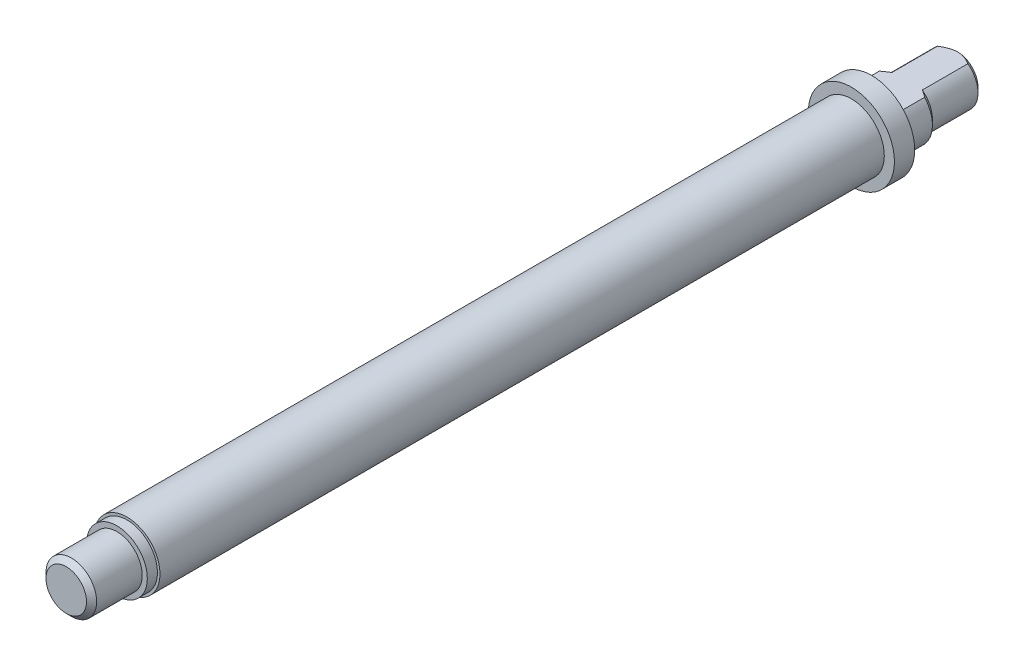
ISO-10303-21;
HEADER;
FILE_DESCRIPTION(('STEP AP214'),'2;1');
FILE_NAME('part.step','',(''),(''),'','','');
FILE_SCHEMA(('AUTOMOTIVE_DESIGN { 1 0 10303 214 1 1 1 1 }'));
ENDSEC;
DATA;
#1=APPLICATION_CONTEXT('core data for automotive mechanical design processes');
#2=APPLICATION_PROTOCOL_DEFINITION('international standard','automotive_design',2000,#1);
#3=PRODUCT_CONTEXT('',#1,'mechanical');
#4=PRODUCT('Part','Part','',(#3));
#5=PRODUCT_RELATED_PRODUCT_CATEGORY('part','',(#4));
#6=PRODUCT_DEFINITION_FORMATION('','',#4);
#7=PRODUCT_DEFINITION_CONTEXT('part definition',#1,'design');
#8=PRODUCT_DEFINITION('design','',#6,#7);
#9=PRODUCT_DEFINITION_SHAPE('','',#8);
#10=(LENGTH_UNIT() NAMED_UNIT(*) SI_UNIT(.MILLI.,.METRE.));
#11=(NAMED_UNIT(*) PLANE_ANGLE_UNIT() SI_UNIT($,.RADIAN.));
#12=(NAMED_UNIT(*) SI_UNIT($,.STERADIAN.) SOLID_ANGLE_UNIT());
#13=UNCERTAINTY_MEASURE_WITH_UNIT(LENGTH_MEASURE(1.E-05),#10,'distance_accuracy_value','');
#14=(GEOMETRIC_REPRESENTATION_CONTEXT(3) GLOBAL_UNCERTAINTY_ASSIGNED_CONTEXT((#13)) GLOBAL_UNIT_ASSIGNED_CONTEXT((#10,
#11,#12)) REPRESENTATION_CONTEXT('',''));
#15=CARTESIAN_POINT('',(0.,0.,0.));
#16=DIRECTION('',(0.,0.,1.));
#17=DIRECTION('',(1.,0.,0.));
#18=AXIS2_PLACEMENT_3D('',#15,#16,#17);
#19=CARTESIAN_POINT('',(0.,0.,36.75));
#20=DIRECTION('',(0.,0.,1.));
#21=DIRECTION('',(1.,0.,0.));
#22=AXIS2_PLACEMENT_3D('',#19,#20,#21);
#23=PLANE('',#22);
#24=CARTESIAN_POINT('',(0.,0.,36.75));
#25=DIRECTION('',(0.,0.,1.));
#26=DIRECTION('',(1.,0.,0.));
#27=AXIS2_PLACEMENT_3D('',#24,#25,#26);
#28=CIRCLE('',#27,3.);
#29=CARTESIAN_POINT('',(3.,0.,36.75));
#30=VERTEX_POINT('',#29);
#31=EDGE_CURVE('E141',#30,#30,#28,.T.);
#32=ORIENTED_EDGE('',*,*,#31,.F.);
#33=EDGE_LOOP('',(#32));
#34=FACE_BOUND('',#33,.T.);
#35=CARTESIAN_POINT('',(0.,0.,36.75));
#36=DIRECTION('',(0.,0.,1.));
#37=DIRECTION('',(1.,0.,0.));
#38=AXIS2_PLACEMENT_3D('',#35,#36,#37);
#39=CIRCLE('',#38,3.25);
#40=CARTESIAN_POINT('',(3.25,0.,36.75));
#41=VERTEX_POINT('',#40);
#42=EDGE_CURVE('E154',#41,#41,#39,.T.);
#43=ORIENTED_EDGE('',*,*,#42,.T.);
#44=EDGE_LOOP('',(#43));
#45=FACE_BOUND('',#44,.T.);
#46=ADVANCED_FACE('F34',(#34,#45),#23,.T.);
#47=CARTESIAN_POINT('',(0.,0.,37.75));
#48=DIRECTION('',(0.,0.,1.));
#49=DIRECTION('',(1.,0.,0.));
#50=AXIS2_PLACEMENT_3D('',#47,#48,#49);
#51=PLANE('',#50);
#52=CARTESIAN_POINT('',(0.,0.,37.75));
#53=DIRECTION('',(0.,0.,1.));
#54=DIRECTION('',(1.,0.,0.));
#55=AXIS2_PLACEMENT_3D('',#52,#53,#54);
#56=CIRCLE('',#55,3.);
#57=CARTESIAN_POINT('',(3.,0.,37.75));
#58=VERTEX_POINT('',#57);
#59=EDGE_CURVE('E107',#58,#58,#56,.T.);
#60=ORIENTED_EDGE('',*,*,#59,.T.);
#61=EDGE_LOOP('',(#60));
#62=FACE_BOUND('',#61,.T.);
#63=CARTESIAN_POINT('',(0.,0.,37.75));
#64=DIRECTION('',(0.,0.,1.));
#65=DIRECTION('',(1.,0.,0.));
#66=AXIS2_PLACEMENT_3D('',#63,#64,#65);
#67=CIRCLE('',#66,2.5);
#68=CARTESIAN_POINT('',(2.5,0.,37.75));
#69=VERTEX_POINT('',#68);
#70=EDGE_CURVE('E138',#69,#69,#67,.T.);
#71=ORIENTED_EDGE('',*,*,#70,.F.);
#72=EDGE_LOOP('',(#71));
#73=FACE_BOUND('',#72,.T.);
#74=ADVANCED_FACE('F150',(#62,#73),#51,.T.);
#75=CARTESIAN_POINT('',(0.,0.,37.75));
#76=DIRECTION('',(0.,0.,-1.));
#77=DIRECTION('',(-1.,0.,0.));
#78=AXIS2_PLACEMENT_3D('',#75,#76,#77);
#79=CYLINDRICAL_SURFACE('',#78,3.);
#80=ORIENTED_EDGE('',*,*,#59,.F.);
#81=EDGE_LOOP('',(#80));
#82=FACE_BOUND('',#81,.T.);
#83=ORIENTED_EDGE('',*,*,#31,.T.);
#84=EDGE_LOOP('',(#83));
#85=FACE_BOUND('',#84,.T.);
#86=ADVANCED_FACE('F146',(#82,#85),#79,.T.);
#87=CARTESIAN_POINT('',(0.,0.,42.75));
#88=DIRECTION('',(0.,0.,-1.));
#89=DIRECTION('',(-1.,0.,0.));
#90=AXIS2_PLACEMENT_3D('',#87,#88,#89);
#91=CYLINDRICAL_SURFACE('',#90,2.5);
#92=CARTESIAN_POINT('',(0.,0.,42.25));
#93=DIRECTION('',(0.,0.,1.));
#94=DIRECTION('',(1.,0.,0.));
#95=AXIS2_PLACEMENT_3D('',#92,#93,#94);
#96=CIRCLE('',#95,2.5);
#97=CARTESIAN_POINT('',(2.5,0.,42.25));
#98=VERTEX_POINT('',#97);
#99=EDGE_CURVE('E116',#98,#98,#96,.F.);
#100=ORIENTED_EDGE('',*,*,#99,.T.);
#101=EDGE_LOOP('',(#100));
#102=FACE_BOUND('',#101,.T.);
#103=ORIENTED_EDGE('',*,*,#70,.T.);
#104=EDGE_LOOP('',(#103));
#105=FACE_BOUND('',#104,.T.);
#106=ADVANCED_FACE('F190',(#102,#105),#91,.T.);
#107=CARTESIAN_POINT('',(0.,0.,42.75));
#108=DIRECTION('',(0.,0.,1.));
#109=DIRECTION('',(1.,0.,0.));
#110=AXIS2_PLACEMENT_3D('',#107,#108,#109);
#111=PLANE('',#110);
#112=CARTESIAN_POINT('',(0.,0.,42.75));
#113=DIRECTION('',(0.,0.,1.));
#114=DIRECTION('',(1.,0.,0.));
#115=AXIS2_PLACEMENT_3D('',#112,#113,#114);
#116=CIRCLE('',#115,2.00000000000003);
#117=CARTESIAN_POINT('',(2.00000000000003,0.,42.75));
#118=VERTEX_POINT('',#117);
#119=EDGE_CURVE('E113',#118,#118,#116,.T.);
#120=ORIENTED_EDGE('',*,*,#119,.T.);
#121=EDGE_LOOP('',(#120));
#122=FACE_BOUND('',#121,.T.);
#123=ADVANCED_FACE('F186',(#122),#111,.T.);
#124=CARTESIAN_POINT('',(0.,0.,42.75));
#125=DIRECTION('',(0.,0.,-1.));
#126=DIRECTION('',(-1.,0.,0.));
#127=AXIS2_PLACEMENT_3D('',#124,#125,#126);
#128=CONICAL_SURFACE('',#127,2.00000000000003,0.785398163397439);
#129=ORIENTED_EDGE('',*,*,#99,.F.);
#130=EDGE_LOOP('',(#129));
#131=FACE_BOUND('',#130,.T.);
#132=ORIENTED_EDGE('',*,*,#119,.F.);
#133=EDGE_LOOP('',(#132));
#134=FACE_BOUND('',#133,.T.);
#135=ADVANCED_FACE('F189',(#131,#134),#128,.T.);
#136=CARTESIAN_POINT('',(0.,0.,-34.75));
#137=DIRECTION('',(0.,0.,1.));
#138=DIRECTION('',(1.,0.,0.));
#139=AXIS2_PLACEMENT_3D('',#136,#137,#138);
#140=PLANE('',#139);
#141=CARTESIAN_POINT('',(0.,0.,-34.75));
#142=DIRECTION('',(0.,0.,1.));
#143=DIRECTION('',(1.,0.,0.));
#144=AXIS2_PLACEMENT_3D('',#141,#142,#143);
#145=CIRCLE('',#144,3.25);
#146=CARTESIAN_POINT('',(3.25,0.,-34.75));
#147=VERTEX_POINT('',#146);
#148=EDGE_CURVE('E156',#147,#147,#145,.T.);
#149=ORIENTED_EDGE('',*,*,#148,.F.);
#150=EDGE_LOOP('',(#149));
#151=FACE_BOUND('',#150,.T.);
#152=CARTESIAN_POINT('',(0.,0.,-34.75));
#153=DIRECTION('',(0.,0.,1.));
#154=DIRECTION('',(1.,0.,0.));
#155=AXIS2_PLACEMENT_3D('',#152,#153,#154);
#156=CIRCLE('',#155,4.25);
#157=CARTESIAN_POINT('',(4.25,0.,-34.75));
#158=VERTEX_POINT('',#157);
#159=EDGE_CURVE('E87',#158,#158,#156,.T.);
#160=ORIENTED_EDGE('',*,*,#159,.T.);
#161=EDGE_LOOP('',(#160));
#162=FACE_BOUND('',#161,.T.);
#163=ADVANCED_FACE('F176',(#151,#162),#140,.T.);
#164=CARTESIAN_POINT('',(0.,0.,-34.75));
#165=DIRECTION('',(0.,0.,1.));
#166=DIRECTION('',(1.,0.,0.));
#167=AXIS2_PLACEMENT_3D('',#164,#165,#166);
#168=CYLINDRICAL_SURFACE('',#167,3.25);
#169=ORIENTED_EDGE('',*,*,#148,.T.);
#170=EDGE_LOOP('',(#169));
#171=FACE_BOUND('',#170,.T.);
#172=ORIENTED_EDGE('',*,*,#42,.F.);
#173=EDGE_LOOP('',(#172));
#174=FACE_BOUND('',#173,.T.);
#175=ADVANCED_FACE('F170',(#171,#174),#168,.T.);
#176=CARTESIAN_POINT('',(0.,0.,-45.25));
#177=DIRECTION('',(0.,0.,-1.));
#178=DIRECTION('',(-1.,0.,0.));
#179=AXIS2_PLACEMENT_3D('',#176,#177,#178);
#180=PLANE('',#179);
#181=CARTESIAN_POINT('',(0.,0.,-45.25));
#182=DIRECTION('',(0.,0.,-1.));
#183=DIRECTION('',(-1.,0.,0.));
#184=AXIS2_PLACEMENT_3D('',#181,#182,#183);
#185=CIRCLE('',#184,2.00000000000003);
#186=CARTESIAN_POINT('',(0.,2.,-45.25));
#187=VERTEX_POINT('',#186);
#188=EDGE_CURVE('E100',#187,#187,#185,.T.);
#189=ORIENTED_EDGE('',*,*,#188,.T.);
#190=EDGE_LOOP('',(#189));
#191=FACE_BOUND('',#190,.T.);
#192=ADVANCED_FACE('F168',(#191),#180,.T.);
#193=CARTESIAN_POINT('',(0.,0.,-45.25));
#194=DIRECTION('',(0.,0.,1.));
#195=DIRECTION('',(1.,0.,0.));
#196=AXIS2_PLACEMENT_3D('',#193,#194,#195);
#197=CONICAL_SURFACE('',#196,2.00000000000003,0.785398163397439);
#198=CARTESIAN_POINT('',(-4.02524487287732,2.,-42.7552701653353));
#199=CARTESIAN_POINT('',(-3.93338656559503,2.,-42.8375217206694));
#200=CARTESIAN_POINT('',(-3.84126127996534,2.,-42.9194777630483));
#201=CARTESIAN_POINT('',(-3.65633622016193,2.,-43.0826420150682));
#202=CARTESIAN_POINT('',(-3.56353638507523,2.,-43.1638501556327));
#203=CARTESIAN_POINT('',(-3.37679065484129,2.,-43.3256480230057));
#204=CARTESIAN_POINT('',(-3.28284177522376,2.,-43.4062343111818));
#205=CARTESIAN_POINT('',(-3.09396170046439,2.,-43.566241356936));
#206=CARTESIAN_POINT('',(-2.99903054598731,2.,-43.6456621624367));
#207=CARTESIAN_POINT('',(-2.80231868574972,2.,-43.8076618695362));
#208=CARTESIAN_POINT('',(-2.7004639581137,2.,-43.8901511403073));
#209=CARTESIAN_POINT('',(-2.49502065799541,2.,-44.0529394966641));
#210=CARTESIAN_POINT('',(-2.39143218029121,2.,-44.1332387013461));
#211=CARTESIAN_POINT('',(-2.18217141569413,2.,-44.2907552208728));
#212=CARTESIAN_POINT('',(-2.07650249233657,2.,-44.3679769835109));
#213=CARTESIAN_POINT('',(-1.86228016066993,2.,-44.5182890730739));
#214=CARTESIAN_POINT('',(-1.7537276355555,2.,-44.5913806440338));
#215=CARTESIAN_POINT('',(-1.56257875752936,2.,-44.7127220691165));
#216=CARTESIAN_POINT('',(-1.48086803544078,2.,-44.7623596167979));
#217=CARTESIAN_POINT('',(-1.31495821323155,2.,-44.8574104299912));
#218=CARTESIAN_POINT('',(-1.23075822227053,2.,-44.9028221584837));
#219=CARTESIAN_POINT('',(-1.06023902355461,2.,-44.9875500940183));
#220=CARTESIAN_POINT('',(-0.973945152787866,2.,-45.0269166708474));
#221=CARTESIAN_POINT('',(-0.798278775330244,2.,-45.0980658869435));
#222=CARTESIAN_POINT('',(-0.708908734252937,2.,-45.1298544452973));
#223=CARTESIAN_POINT('',(-0.559541387776288,2.,-45.1739554616647));
#224=CARTESIAN_POINT('',(-0.500403045428492,2.,-45.1891736445886));
#225=CARTESIAN_POINT('',(-0.381108626655489,2.,-45.2148450536554));
#226=CARTESIAN_POINT('',(-0.320952978782938,2.,-45.225300236847));
#227=CARTESIAN_POINT('',(-0.200181452597934,2.,-45.2408949804001));
#228=CARTESIAN_POINT('',(-0.139568224383854,2.,-45.2460547746351));
#229=CARTESIAN_POINT('',(-0.0181203079271185,2.,-45.2508382229008));
#230=CARTESIAN_POINT('',(0.0427143780219665,2.,-45.2504619341049));
#231=CARTESIAN_POINT('',(0.163839037596709,2.,-45.244208583769));
#232=CARTESIAN_POINT('',(0.224130225918196,2.,-45.2383546366808));
#233=CARTESIAN_POINT('',(0.343991547443547,2.,-45.2215015109567));
#234=CARTESIAN_POINT('',(0.403561514966845,2.,-45.2105011722532));
#235=CARTESIAN_POINT('',(0.522342234602058,2.,-45.1837349239598));
#236=CARTESIAN_POINT('',(0.581540567552781,2.,-45.1679146042935));
#237=CARTESIAN_POINT('',(0.698671365380795,2.,-45.1322112796639));
#238=CARTESIAN_POINT('',(0.756604050119123,2.,-45.1123289866356));
#239=CARTESIAN_POINT('',(0.887860927745178,2.,-45.0628560581075));
#240=CARTESIAN_POINT('',(0.960752844289883,2.,-45.0321244984101));
#241=CARTESIAN_POINT('',(1.10449637010197,2.,-44.9661808969027));
#242=CARTESIAN_POINT('',(1.17534687727413,2.,-44.9309664885298));
#243=CARTESIAN_POINT('',(1.31542984339301,2.,-44.8569247865524));
#244=CARTESIAN_POINT('',(1.38465593395351,2.,-44.8180855391967));
#245=CARTESIAN_POINT('',(1.52149299869846,2.,-44.7376549997552));
#246=CARTESIAN_POINT('',(1.58910373202624,2.,-44.6960633007095));
#247=CARTESIAN_POINT('',(1.71962468526386,2.,-44.6128214933671));
#248=CARTESIAN_POINT('',(1.78260199281822,2.,-44.5712760281912));
#249=CARTESIAN_POINT('',(1.90748425118683,2.,-44.4865978718586));
#250=CARTESIAN_POINT('',(1.96938911660686,2.,-44.4434650551541));
#251=CARTESIAN_POINT('',(2.09174110166171,2.,-44.3562912155002));
#252=CARTESIAN_POINT('',(2.15219622437851,2.,-44.3122613860916));
#253=CARTESIAN_POINT('',(2.27230748022882,2.,-44.223157067966));
#254=CARTESIAN_POINT('',(2.33196382265272,2.,-44.1780828616879));
#255=CARTESIAN_POINT('',(2.39129047517791,2.,-44.1325859856804));
#256=B_SPLINE_CURVE_WITH_KNOTS('',3,(#198,#199,#200,#201,#202,#203,#204,#205,#206,#207,#208,
#209,#210,#211,#212,#213,#214,#215,#216,#217,#218,#219,#220,#221,#222,#223,#224,#225,#226,#227,
#228,#229,#230,#231,#232,#233,#234,#235,#236,#237,#238,#239,#240,#241,#242,#243,#244,#245,#246,
#247,#248,#249,#250,#251,#252,#253,#254,#255),.UNSPECIFIED.,.F.,.F.,(4,2,2,2,2,2,2,2,2,2,2,2,2,
2,2,2,2,2,2,2,2,2,2,2,2,2,2,2,4),(0.,0.369906577290642,0.739846983359827,1.11116790415774,
1.48247351382389,1.87565592605001,2.26881691411835,2.66138738129623,3.05383896694485,
3.34056558561761,3.6273960884676,3.91168916131591,4.19575944375506,4.37878987167405,
4.56174502701619,4.74399847152468,4.92625003382966,5.1077359882982,5.28926287192774,
5.4729200122429,5.65654499086521,5.89365897291801,6.13089865416207,6.36895036811938,
6.60703735784724,6.83334806436309,7.05967670901748,7.28403255416335,7.50832841730318),.UNSPECIFIED.);
#257=CARTESIAN_POINT('',(1.5,2.,-44.75));
#258=VERTEX_POINT('',#257);
#259=EDGE_CURVE('E128',#258,#187,#256,.F.);
#260=ORIENTED_EDGE('',*,*,#259,.F.);
#261=CARTESIAN_POINT('',(0.,0.,-44.75));
#262=DIRECTION('',(0.,0.,-1.));
#263=DIRECTION('',(-1.,0.,0.));
#264=AXIS2_PLACEMENT_3D('',#261,#262,#263);
#265=CIRCLE('',#264,2.5);
#266=CARTESIAN_POINT('',(-1.5,2.,-44.75));
#267=VERTEX_POINT('',#266);
#268=EDGE_CURVE('E104',#267,#258,#265,.F.);
#269=ORIENTED_EDGE('',*,*,#268,.F.);
#270=EDGE_CURVE('E121',#187,#267,#256,.F.);
#271=ORIENTED_EDGE('',*,*,#270,.F.);
#272=ORIENTED_EDGE('',*,*,#188,.F.);
#273=EDGE_LOOP('',(#260,#269,#271,#272));
#274=FACE_BOUND('',#273,.T.);
#275=ADVANCED_FACE('F165',(#274),#197,.T.);
#276=CARTESIAN_POINT('',(0.,0.,-45.25));
#277=DIRECTION('',(0.,0.,1.));
#278=DIRECTION('',(1.,0.,0.));
#279=AXIS2_PLACEMENT_3D('',#276,#277,#278);
#280=CYLINDRICAL_SURFACE('',#279,2.5);
#281=ORIENTED_EDGE('',*,*,#268,.T.);
#282=DIRECTION('',(0.,0.,1.));
#283=VECTOR('',#282,1.);
#284=CARTESIAN_POINT('',(1.5,2.,-45.25));
#285=LINE('',#284,#283);
#286=CARTESIAN_POINT('',(1.5,2.,-40.25));
#287=VERTEX_POINT('',#286);
#288=EDGE_CURVE('E96',#258,#287,#285,.T.);
#289=ORIENTED_EDGE('',*,*,#288,.T.);
#290=CARTESIAN_POINT('',(0.,0.,-40.25));
#291=DIRECTION('',(0.,0.,-1.));
#292=DIRECTION('',(-1.,0.,0.));
#293=AXIS2_PLACEMENT_3D('',#290,#291,#292);
#294=CIRCLE('',#293,2.5);
#295=CARTESIAN_POINT('',(-1.5,2.,-40.25));
#296=VERTEX_POINT('',#295);
#297=EDGE_CURVE('E95',#287,#296,#294,.T.);
#298=ORIENTED_EDGE('',*,*,#297,.T.);
#299=DIRECTION('',(0.,0.,1.));
#300=VECTOR('',#299,1.);
#301=CARTESIAN_POINT('',(-1.5,2.,-45.25));
#302=LINE('',#301,#300);
#303=EDGE_CURVE('E55',#296,#267,#302,.F.);
#304=ORIENTED_EDGE('',*,*,#303,.T.);
#305=EDGE_LOOP('',(#281,#289,#298,#304));
#306=FACE_BOUND('',#305,.T.);
#307=ADVANCED_FACE('F126',(#306),#280,.T.);
#308=CARTESIAN_POINT('',(0.,0.,-40.25));
#309=DIRECTION('',(0.,0.,1.));
#310=DIRECTION('',(1.,0.,0.));
#311=AXIS2_PLACEMENT_3D('',#308,#309,#310);
#312=CONICAL_SURFACE('',#311,2.50000000000002,0.785398163397453);
#313=CARTESIAN_POINT('',(6.30297669939974,2.,-36.1373216263623));
#314=CARTESIAN_POINT('',(6.19161538231923,2.,-36.2434654188677));
#315=CARTESIAN_POINT('',(6.08012784166976,2.,-36.3494766865766));
#316=CARTESIAN_POINT('',(5.85685182740821,2.,-36.5611832346176));
#317=CARTESIAN_POINT('',(5.74506335186336,2.,-36.666878512911));
#318=CARTESIAN_POINT('',(5.40910374007522,2.,-36.9834799534095));
#319=CARTESIAN_POINT('',(5.18441017570405,2.,-37.1938332007284));
#320=CARTESIAN_POINT('',(4.73080338017173,2.,-37.6145130906793));
#321=CARTESIAN_POINT('',(4.50187041839723,2.,-37.8248184834026));
#322=CARTESIAN_POINT('',(4.04109600653748,2.,-38.2421398339185));
#323=CARTESIAN_POINT('',(3.80925519025911,2.,-38.4491564869832));
#324=CARTESIAN_POINT('',(3.41557477398931,2.,-38.7927094339617));
#325=CARTESIAN_POINT('',(3.25498354268553,2.,-38.9306734892414));
#326=CARTESIAN_POINT('',(2.93065759329857,2.,-39.2030414106355));
#327=CARTESIAN_POINT('',(2.76692149007151,2.,-39.3374436429248));
#328=CARTESIAN_POINT('',(2.51812669562772,2.,-39.5346540132489));
#329=CARTESIAN_POINT('',(2.43475662118931,2.,-39.599589732802));
#330=CARTESIAN_POINT('',(2.26663374732058,2.,-39.7276417312762));
#331=CARTESIAN_POINT('',(2.18188103848771,2.,-39.7907581286648));
#332=CARTESIAN_POINT('',(2.01072574565119,2.,-39.9145933363178));
#333=CARTESIAN_POINT('',(1.92432436509388,2.,-39.9753138031099));
#334=CARTESIAN_POINT('',(1.74941695008951,2.,-40.0936296466813));
#335=CARTESIAN_POINT('',(1.66091137740154,2.,-40.1512257001644));
#336=CARTESIAN_POINT('',(1.50227028732209,2.,-40.2492212710428));
#337=CARTESIAN_POINT('',(1.43267637104491,2.,-40.2904935943275));
#338=CARTESIAN_POINT('',(1.29167710661282,2.,-40.3698677964186));
#339=CARTESIAN_POINT('',(1.22027148128114,2.,-40.4079691862347));
#340=CARTESIAN_POINT('',(1.07546452699163,2.,-40.4800460130542));
#341=CARTESIAN_POINT('',(1.00206522711492,2.,-40.5140254658395));
#342=CARTESIAN_POINT('',(0.853081142949222,2.,-40.5767151787812));
#343=CARTESIAN_POINT('',(0.777497091069965,2.,-40.6054271816017));
#344=CARTESIAN_POINT('',(0.584403393214701,2.,-40.6692396638115));
#345=CARTESIAN_POINT('',(0.465352306558866,2.,-40.7000128348776));
#346=CARTESIAN_POINT('',(0.28439755594838,2.,-40.7307588195802));
#347=CARTESIAN_POINT('',(0.223763847529603,2.,-40.738438502314));
#348=CARTESIAN_POINT('',(0.102037460980343,2.,-40.7483151195682));
#349=CARTESIAN_POINT('',(0.0409448065907219,2.,-40.7505123357594));
#350=CARTESIAN_POINT('',(-0.0813412240179013,2.,-40.7492836906337));
#351=CARTESIAN_POINT('',(-0.142534443442943,2.,-40.7458430479095));
#352=CARTESIAN_POINT('',(-0.264365149349608,2.,-40.7335143071468));
#353=CARTESIAN_POINT('',(-0.325002595336135,2.,-40.7246258153165));
#354=CARTESIAN_POINT('',(-0.445513581327994,2.,-40.7018382366568));
#355=CARTESIAN_POINT('',(-0.505384108194542,2.,-40.687923432345));
#356=CARTESIAN_POINT('',(-0.623920460080722,2.,-40.6557165246167));
#357=CARTESIAN_POINT('',(-0.682586214925769,2.,-40.6374241670009));
#358=CARTESIAN_POINT('',(-0.870096679141436,2.,-40.5723195036355));
#359=CARTESIAN_POINT('',(-0.996380524334678,2.,-40.5181300929727));
#360=CARTESIAN_POINT('',(-1.24305957355021,2.,-40.397647858965));
#361=CARTESIAN_POINT('',(-1.36344236007691,2.,-40.3313307945582));
#362=CARTESIAN_POINT('',(-1.60114682986076,2.,-40.1898352181218));
#363=CARTESIAN_POINT('',(-1.71840078274321,2.,-40.1145442578528));
#364=CARTESIAN_POINT('',(-1.89143789202107,2.,-39.9975913945842));
#365=CARTESIAN_POINT('',(-1.94861845845224,2.,-39.957955998579));
#366=CARTESIAN_POINT('',(-2.06217670530463,2.,-39.877551275221));
#367=CARTESIAN_POINT('',(-2.11855440502141,2.,-39.8367819751894));
#368=CARTESIAN_POINT('',(-2.27151937990438,2.,-39.7241967692871));
#369=CARTESIAN_POINT('',(-2.36741546158154,2.,-39.6514431443247));
#370=CARTESIAN_POINT('',(-2.55757734840221,2.,-39.503830369953));
#371=CARTESIAN_POINT('',(-2.65184301372985,2.,-39.4289710414012));
#372=CARTESIAN_POINT('',(-2.83909574994448,2.,-39.2776197624692));
#373=CARTESIAN_POINT('',(-2.93208245025607,2.,-39.2011273546396));
#374=CARTESIAN_POINT('',(-3.11700238327248,2.,-39.0468779319395));
#375=CARTESIAN_POINT('',(-3.2089355891292,2.,-38.9691208849616));
#376=CARTESIAN_POINT('',(-3.48375900151838,2.,-38.7340952575394));
#377=CARTESIAN_POINT('',(-3.6653640747173,2.,-38.5753249307298));
#378=CARTESIAN_POINT('',(-4.02619748135236,2.,-38.2551814767042));
#379=CARTESIAN_POINT('',(-4.20542620770818,2.,-38.0938087898096));
#380=CARTESIAN_POINT('',(-4.54602117157567,2.,-37.7839365817311));
#381=CARTESIAN_POINT('',(-4.70753312366636,2.,-37.6355969838317));
#382=CARTESIAN_POINT('',(-5.02950930464932,2.,-37.3377703518185));
#383=CARTESIAN_POINT('',(-5.18997348014397,2.,-37.188283260057));
#384=CARTESIAN_POINT('',(-5.50956314093424,2.,-36.8889288168519));
#385=CARTESIAN_POINT('',(-5.66869128700745,2.,-36.7390643030356));
#386=CARTESIAN_POINT('',(-5.98628664721593,2.,-36.4386586900714));
#387=CARTESIAN_POINT('',(-6.14475390713851,2.,-36.2881176393484));
#388=CARTESIAN_POINT('',(-6.30297669939974,2.,-36.1373216263623));
#389=B_SPLINE_CURVE_WITH_KNOTS('',3,(#313,#314,#315,#316,#317,#318,#319,#320,#321,#322,#323,
#324,#325,#326,#327,#328,#329,#330,#331,#332,#333,#334,#335,#336,#337,#338,#339,#340,#341,#342,
#343,#344,#345,#346,#347,#348,#349,#350,#351,#352,#353,#354,#355,#356,#357,#358,#359,#360,#361,
#362,#363,#364,#365,#366,#367,#368,#369,#370,#371,#372,#373,#374,#375,#376,#377,#378,#379,#380,
#381,#382,#383,#384,#385,#386,#387,#388),.UNSPECIFIED.,.F.,.F.,(4,2,2,2,2,2,2,2,2,2,2,2,2,2,2,2,
2,2,2,2,2,2,2,2,2,2,2,2,2,2,2,2,2,2,2,2,2,4),(0.,0.461530395848075,0.923063762999847,
1.84642814570782,2.77901494137714,3.71140188239747,4.34652018448138,4.98192494520126,
5.29893184459037,5.61591805480016,5.93268111936175,6.24937530133091,6.49204579715619,
6.73475364617262,6.97722310585566,7.21961220258087,7.58685502448715,7.76999772547678,
7.953131017015,8.13674521833649,8.32037269357642,8.50457942200895,8.68879684970659,
9.09991327785315,9.51186062066993,9.92965689883878,10.1383717107001,10.3470814979543,
10.7081519451167,11.0692532037655,11.4304569749129,11.7916699308901,12.5152929670805,
13.2387948242448,13.8966755650346,14.5545895756197,15.2103542781078,15.8660727671493),.UNSPECIFIED.);
#390=CARTESIAN_POINT('',(2.23606797749979,2.,-39.75));
#391=VERTEX_POINT('',#390);
#392=EDGE_CURVE('E11',#391,#287,#389,.T.);
#393=ORIENTED_EDGE('',*,*,#392,.F.);
#394=CARTESIAN_POINT('',(0.,0.,-39.75));
#395=DIRECTION('',(0.,0.,-1.));
#396=DIRECTION('',(-1.,0.,0.));
#397=AXIS2_PLACEMENT_3D('',#394,#395,#396);
#398=CIRCLE('',#397,3.);
#399=CARTESIAN_POINT('',(-2.23606797749979,2.,-39.75));
#400=VERTEX_POINT('',#399);
#401=EDGE_CURVE('E94',#400,#391,#398,.F.);
#402=ORIENTED_EDGE('',*,*,#401,.F.);
#403=EDGE_CURVE('E39',#296,#400,#389,.T.);
#404=ORIENTED_EDGE('',*,*,#403,.F.);
#405=ORIENTED_EDGE('',*,*,#297,.F.);
#406=EDGE_LOOP('',(#393,#402,#404,#405));
#407=FACE_BOUND('',#406,.T.);
#408=ADVANCED_FACE('F36',(#407),#312,.T.);
#409=CARTESIAN_POINT('',(0.,0.,-40.25));
#410=DIRECTION('',(0.,0.,1.));
#411=DIRECTION('',(1.,0.,0.));
#412=AXIS2_PLACEMENT_3D('',#409,#410,#411);
#413=CYLINDRICAL_SURFACE('',#412,3.);
#414=ORIENTED_EDGE('',*,*,#401,.T.);
#415=DIRECTION('',(0.,0.,1.));
#416=VECTOR('',#415,1.);
#417=CARTESIAN_POINT('',(2.23606797749979,2.,-40.25));
#418=LINE('',#417,#416);
#419=CARTESIAN_POINT('',(2.23606797749979,2.,-36.75));
#420=VERTEX_POINT('',#419);
#421=EDGE_CURVE('E61',#391,#420,#418,.T.);
#422=ORIENTED_EDGE('',*,*,#421,.T.);
#423=CARTESIAN_POINT('',(0.,0.,-36.75));
#424=DIRECTION('',(0.,0.,1.));
#425=DIRECTION('',(1.,0.,0.));
#426=AXIS2_PLACEMENT_3D('',#423,#424,#425);
#427=CIRCLE('',#426,3.);
#428=CARTESIAN_POINT('',(-2.23606797749979,2.,-36.75));
#429=VERTEX_POINT('',#428);
#430=EDGE_CURVE('E92',#420,#429,#427,.F.);
#431=ORIENTED_EDGE('',*,*,#430,.T.);
#432=DIRECTION('',(0.,0.,1.));
#433=VECTOR('',#432,1.);
#434=CARTESIAN_POINT('',(-2.23606797749979,2.,-40.25));
#435=LINE('',#434,#433);
#436=EDGE_CURVE('E83',#429,#400,#435,.F.);
#437=ORIENTED_EDGE('',*,*,#436,.T.);
#438=EDGE_LOOP('',(#414,#422,#431,#437));
#439=FACE_BOUND('',#438,.T.);
#440=ADVANCED_FACE('F91',(#439),#413,.T.);
#441=CARTESIAN_POINT('',(3.,2.,-30.0417960675006));
#442=DIRECTION('',(0.,-1.,0.));
#443=DIRECTION('',(0.,0.,-1.));
#444=AXIS2_PLACEMENT_3D('',#441,#442,#443);
#445=PLANE('',#444);
#446=ORIENTED_EDGE('',*,*,#392,.T.);
#447=ORIENTED_EDGE('',*,*,#288,.F.);
#448=ORIENTED_EDGE('',*,*,#259,.T.);
#449=ORIENTED_EDGE('',*,*,#270,.T.);
#450=ORIENTED_EDGE('',*,*,#303,.F.);
#451=ORIENTED_EDGE('',*,*,#403,.T.);
#452=ORIENTED_EDGE('',*,*,#436,.F.);
#453=DIRECTION('',(-1.,0.,0.));
#454=VECTOR('',#453,1.);
#455=CARTESIAN_POINT('',(3.,2.,-36.75));
#456=LINE('',#455,#454);
#457=EDGE_CURVE('E80',#420,#429,#456,.T.);
#458=ORIENTED_EDGE('',*,*,#457,.F.);
#459=ORIENTED_EDGE('',*,*,#421,.F.);
#460=EDGE_LOOP('',(#446,#447,#448,#449,#450,#451,#452,#458,#459));
#461=FACE_BOUND('',#460,.T.);
#462=ADVANCED_FACE('F81',(#461),#445,.F.);
#463=CARTESIAN_POINT('',(0.,0.,-36.75));
#464=DIRECTION('',(0.,0.,1.));
#465=DIRECTION('',(1.,0.,0.));
#466=AXIS2_PLACEMENT_3D('',#463,#464,#465);
#467=PLANE('',#466);
#468=ORIENTED_EDGE('',*,*,#457,.T.);
#469=ORIENTED_EDGE('',*,*,#430,.F.);
#470=EDGE_LOOP('',(#468,#469));
#471=FACE_BOUND('',#470,.T.);
#472=CARTESIAN_POINT('',(0.,0.,-36.75));
#473=DIRECTION('',(0.,0.,1.));
#474=DIRECTION('',(1.,0.,0.));
#475=AXIS2_PLACEMENT_3D('',#472,#473,#474);
#476=CIRCLE('',#475,4.25);
#477=CARTESIAN_POINT('',(4.25,0.,-36.75));
#478=VERTEX_POINT('',#477);
#479=EDGE_CURVE('E101',#478,#478,#476,.T.);
#480=ORIENTED_EDGE('',*,*,#479,.F.);
#481=EDGE_LOOP('',(#480));
#482=FACE_BOUND('',#481,.T.);
#483=ADVANCED_FACE('F98',(#471,#482),#467,.F.);
#484=CARTESIAN_POINT('',(0.,0.,36.75));
#485=DIRECTION('',(0.,0.,-1.));
#486=DIRECTION('',(-1.,0.,0.));
#487=AXIS2_PLACEMENT_3D('',#484,#485,#486);
#488=CYLINDRICAL_SURFACE('',#487,4.25);
#489=ORIENTED_EDGE('',*,*,#479,.T.);
#490=EDGE_LOOP('',(#489));
#491=FACE_BOUND('',#490,.T.);
#492=ORIENTED_EDGE('',*,*,#159,.F.);
#493=EDGE_LOOP('',(#492));
#494=FACE_BOUND('',#493,.T.);
#495=ADVANCED_FACE('F203',(#491,#494),#488,.T.);
#496=CLOSED_SHELL('',(#46,#74,#86,#106,#123,#135,#163,#175,#192,#275,#307,#408,#440,#462,#483,#495));
#497=MANIFOLD_SOLID_BREP('B2',#496);
#498=ADVANCED_BREP_SHAPE_REPRESENTATION('',(#18,#497),#14);
#499=SHAPE_DEFINITION_REPRESENTATION(#9,#498);
ENDSEC;
END-ISO-10303-21;
